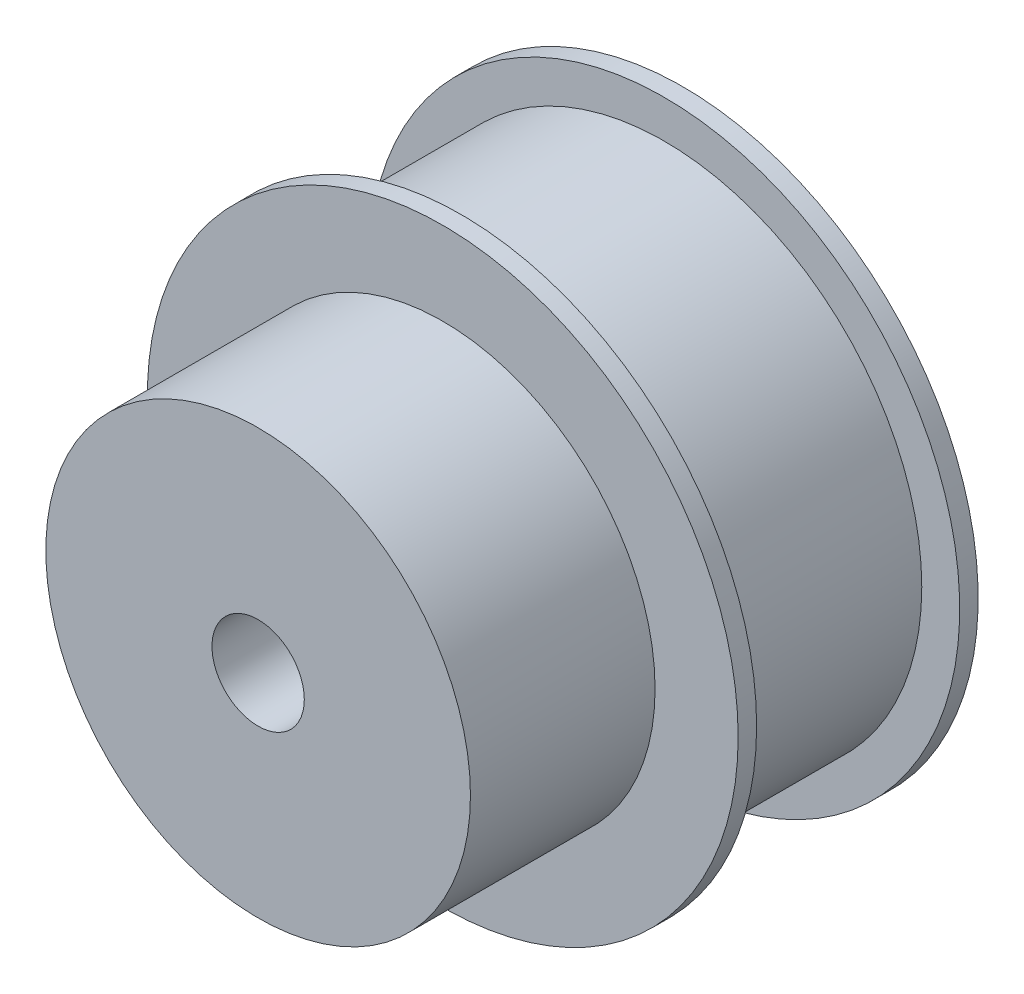
ISO-10303-21;
HEADER;
FILE_DESCRIPTION(('STEP AP214'),'2;1');
FILE_NAME('part.step','',(''),(''),'','','');
FILE_SCHEMA(('AUTOMOTIVE_DESIGN { 1 0 10303 214 1 1 1 1 }'));
ENDSEC;
DATA;
#1=APPLICATION_CONTEXT('core data for automotive mechanical design processes');
#2=APPLICATION_PROTOCOL_DEFINITION('international standard','automotive_design',2000,#1);
#3=PRODUCT_CONTEXT('',#1,'mechanical');
#4=PRODUCT('Part','Part','',(#3));
#5=PRODUCT_RELATED_PRODUCT_CATEGORY('part','',(#4));
#6=PRODUCT_DEFINITION_FORMATION('','',#4);
#7=PRODUCT_DEFINITION_CONTEXT('part definition',#1,'design');
#8=PRODUCT_DEFINITION('design','',#6,#7);
#9=PRODUCT_DEFINITION_SHAPE('','',#8);
#10=(LENGTH_UNIT() NAMED_UNIT(*) SI_UNIT(.MILLI.,.METRE.));
#11=(NAMED_UNIT(*) PLANE_ANGLE_UNIT() SI_UNIT($,.RADIAN.));
#12=(NAMED_UNIT(*) SI_UNIT($,.STERADIAN.) SOLID_ANGLE_UNIT());
#13=UNCERTAINTY_MEASURE_WITH_UNIT(LENGTH_MEASURE(1.E-05),#10,'distance_accuracy_value','');
#14=(GEOMETRIC_REPRESENTATION_CONTEXT(3) GLOBAL_UNCERTAINTY_ASSIGNED_CONTEXT((#13)) GLOBAL_UNIT_ASSIGNED_CONTEXT((#10,
#11,#12)) REPRESENTATION_CONTEXT('',''));
#15=CARTESIAN_POINT('',(0.,0.,0.));
#16=DIRECTION('',(0.,0.,1.));
#17=DIRECTION('',(1.,0.,0.));
#18=AXIS2_PLACEMENT_3D('',#15,#16,#17);
#19=CARTESIAN_POINT('',(0.,0.,-23.));
#20=DIRECTION('',(0.,0.,1.));
#21=DIRECTION('',(1.,0.,0.));
#22=AXIS2_PLACEMENT_3D('',#19,#20,#21);
#23=CYLINDRICAL_SURFACE('',#22,13.945);
#24=CARTESIAN_POINT('',(0.,0.,-22.));
#25=DIRECTION('',(0.,0.,-1.));
#26=DIRECTION('',(-1.,0.,0.));
#27=AXIS2_PLACEMENT_3D('',#24,#25,#26);
#28=CIRCLE('',#27,13.945);
#29=CARTESIAN_POINT('',(13.945,0.,-22.));
#30=VERTEX_POINT('',#29);
#31=EDGE_CURVE('E43',#30,#30,#28,.T.);
#32=CARTESIAN_POINT('',(0.,0.,-11.));
#33=DIRECTION('',(0.,0.,1.));
#34=DIRECTION('',(1.,0.,0.));
#35=AXIS2_PLACEMENT_3D('',#32,#33,#34);
#36=CIRCLE('',#35,13.945);
#37=CARTESIAN_POINT('',(13.945,0.,-11.));
#38=VERTEX_POINT('',#37);
#39=EDGE_CURVE('E10',#38,#38,#36,.T.);
#40=CARTESIAN_POINT('',(13.945,0.,-22.));
#41=CARTESIAN_POINT('',(13.945,0.,-21.8854166666667));
#42=CARTESIAN_POINT('',(13.945,0.,-21.7708333333333));
#43=CARTESIAN_POINT('',(13.945,0.,-21.5416666666667));
#44=CARTESIAN_POINT('',(13.945,0.,-21.4270833333333));
#45=CARTESIAN_POINT('',(13.945,0.,-21.1979166666667));
#46=CARTESIAN_POINT('',(13.945,0.,-21.0833333333333));
#47=CARTESIAN_POINT('',(13.945,0.,-20.8541666666667));
#48=CARTESIAN_POINT('',(13.945,0.,-20.7395833333333));
#49=CARTESIAN_POINT('',(13.945,0.,-20.5104166666667));
#50=CARTESIAN_POINT('',(13.945,0.,-20.3958333333333));
#51=CARTESIAN_POINT('',(13.945,0.,-20.1666666666667));
#52=CARTESIAN_POINT('',(13.945,0.,-20.0520833333333));
#53=CARTESIAN_POINT('',(13.945,0.,-19.8229166666667));
#54=CARTESIAN_POINT('',(13.945,0.,-19.7083333333333));
#55=CARTESIAN_POINT('',(13.945,0.,-19.4791666666667));
#56=CARTESIAN_POINT('',(13.945,0.,-19.3645833333333));
#57=CARTESIAN_POINT('',(13.945,0.,-19.1354166666667));
#58=CARTESIAN_POINT('',(13.945,0.,-19.0208333333333));
#59=CARTESIAN_POINT('',(13.945,0.,-18.7916666666667));
#60=CARTESIAN_POINT('',(13.945,0.,-18.6770833333333));
#61=CARTESIAN_POINT('',(13.945,0.,-18.4479166666667));
#62=CARTESIAN_POINT('',(13.945,0.,-18.3333333333333));
#63=CARTESIAN_POINT('',(13.945,0.,-18.1041666666667));
#64=CARTESIAN_POINT('',(13.945,0.,-17.9895833333333));
#65=CARTESIAN_POINT('',(13.945,0.,-17.7604166666667));
#66=CARTESIAN_POINT('',(13.945,0.,-17.6458333333333));
#67=CARTESIAN_POINT('',(13.945,0.,-17.4166666666667));
#68=CARTESIAN_POINT('',(13.945,0.,-17.3020833333333));
#69=CARTESIAN_POINT('',(13.945,0.,-17.0729166666667));
#70=CARTESIAN_POINT('',(13.945,0.,-16.9583333333333));
#71=CARTESIAN_POINT('',(13.945,0.,-16.7291666666667));
#72=CARTESIAN_POINT('',(13.945,0.,-16.6145833333333));
#73=CARTESIAN_POINT('',(13.945,0.,-16.3854166666667));
#74=CARTESIAN_POINT('',(13.945,0.,-16.2708333333333));
#75=CARTESIAN_POINT('',(13.945,0.,-16.0416666666667));
#76=CARTESIAN_POINT('',(13.945,0.,-15.9270833333333));
#77=CARTESIAN_POINT('',(13.945,0.,-15.6979166666667));
#78=CARTESIAN_POINT('',(13.945,0.,-15.5833333333333));
#79=CARTESIAN_POINT('',(13.945,0.,-15.3541666666667));
#80=CARTESIAN_POINT('',(13.945,0.,-15.2395833333333));
#81=CARTESIAN_POINT('',(13.945,0.,-15.0104166666667));
#82=CARTESIAN_POINT('',(13.945,0.,-14.8958333333333));
#83=CARTESIAN_POINT('',(13.945,0.,-14.6666666666667));
#84=CARTESIAN_POINT('',(13.945,0.,-14.5520833333333));
#85=CARTESIAN_POINT('',(13.945,0.,-14.3229166666667));
#86=CARTESIAN_POINT('',(13.945,0.,-14.2083333333333));
#87=CARTESIAN_POINT('',(13.945,0.,-13.9791666666667));
#88=CARTESIAN_POINT('',(13.945,0.,-13.8645833333333));
#89=CARTESIAN_POINT('',(13.945,0.,-13.6354166666667));
#90=CARTESIAN_POINT('',(13.945,0.,-13.5208333333333));
#91=CARTESIAN_POINT('',(13.945,0.,-13.2916666666667));
#92=CARTESIAN_POINT('',(13.945,0.,-13.1770833333333));
#93=CARTESIAN_POINT('',(13.945,0.,-12.9479166666667));
#94=CARTESIAN_POINT('',(13.945,0.,-12.8333333333333));
#95=CARTESIAN_POINT('',(13.945,0.,-12.6041666666667));
#96=CARTESIAN_POINT('',(13.945,0.,-12.4895833333333));
#97=CARTESIAN_POINT('',(13.945,0.,-12.2604166666667));
#98=CARTESIAN_POINT('',(13.945,0.,-12.1458333333333));
#99=CARTESIAN_POINT('',(13.945,0.,-11.9166666666667));
#100=CARTESIAN_POINT('',(13.945,0.,-11.8020833333333));
#101=CARTESIAN_POINT('',(13.945,0.,-11.5729166666667));
#102=CARTESIAN_POINT('',(13.945,0.,-11.4583333333333));
#103=CARTESIAN_POINT('',(13.945,0.,-11.2291666666667));
#104=CARTESIAN_POINT('',(13.945,0.,-11.1145833333333));
#105=CARTESIAN_POINT('',(13.945,0.,-11.));
#106=B_SPLINE_CURVE_WITH_KNOTS('',3,(#40,#41,#42,#43,#44,#45,#46,#47,#48,#49,#50,#51,#52,#53,
#54,#55,#56,#57,#58,#59,#60,#61,#62,#63,#64,#65,#66,#67,#68,#69,#70,#71,#72,#73,#74,#75,#76,#77,
#78,#79,#80,#81,#82,#83,#84,#85,#86,#87,#88,#89,#90,#91,#92,#93,#94,#95,#96,#97,#98,#99,#100,
#101,#102,#103,#104,#105),.UNSPECIFIED.,.F.,.F.,(4,2,2,2,2,2,2,2,2,2,2,2,2,2,2,2,2,2,2,2,2,2,2,
2,2,2,2,2,2,2,2,2,4),(0.,0.343749999999997,0.687499999999997,1.03125,1.375,1.71875,2.0625,
2.40625,2.75,3.09375,3.4375,3.78125,4.125,4.46875,4.8125,5.15625,5.5,5.84375,6.18749999999999,
6.53125,6.875,7.21875,7.56249999999999,7.90624999999999,8.24999999999999,8.59374999999999,
8.93749999999999,9.28124999999999,9.62499999999999,9.96874999999999,10.3125,10.65625,11.),.UNSPECIFIED.);
#107=EDGE_CURVE('BSEAM36',#30,#38,#106,.T.);
#108=ORIENTED_EDGE('',*,*,#31,.F.);
#109=ORIENTED_EDGE('',*,*,#39,.F.);
#110=ORIENTED_EDGE('',*,*,#107,.T.);
#111=ORIENTED_EDGE('',*,*,#107,.F.);
#112=EDGE_LOOP('',(#108,#110,#109,#111));
#113=FACE_BOUND('',#112,.T.);
#114=ADVANCED_FACE('F36',(#113),#23,.T.);
#115=CARTESIAN_POINT('',(0.,0.,-22.));
#116=DIRECTION('',(0.,0.,-1.));
#117=DIRECTION('',(-1.,0.,0.));
#118=AXIS2_PLACEMENT_3D('',#115,#116,#117);
#119=CYLINDRICAL_SURFACE('',#118,16.);
#120=CARTESIAN_POINT('',(0.,0.,-22.));
#121=DIRECTION('',(0.,0.,-1.));
#122=DIRECTION('',(-1.,0.,0.));
#123=AXIS2_PLACEMENT_3D('',#120,#121,#122);
#124=CIRCLE('',#123,16.);
#125=CARTESIAN_POINT('',(-16.,0.,-22.));
#126=VERTEX_POINT('',#125);
#127=EDGE_CURVE('E56',#126,#126,#124,.T.);
#128=ORIENTED_EDGE('',*,*,#127,.T.);
#129=EDGE_LOOP('',(#128));
#130=FACE_BOUND('',#129,.T.);
#131=CARTESIAN_POINT('',(0.,0.,-23.));
#132=DIRECTION('',(0.,0.,-1.));
#133=DIRECTION('',(-1.,0.,0.));
#134=AXIS2_PLACEMENT_3D('',#131,#132,#133);
#135=CIRCLE('',#134,16.);
#136=CARTESIAN_POINT('',(-16.,0.,-23.));
#137=VERTEX_POINT('',#136);
#138=EDGE_CURVE('E57',#137,#137,#135,.T.);
#139=ORIENTED_EDGE('',*,*,#138,.F.);
#140=EDGE_LOOP('',(#139));
#141=FACE_BOUND('',#140,.T.);
#142=ADVANCED_FACE('F99',(#130,#141),#119,.T.);
#143=CARTESIAN_POINT('',(0.,0.,-22.));
#144=DIRECTION('',(0.,0.,-1.));
#145=DIRECTION('',(-1.,0.,0.));
#146=AXIS2_PLACEMENT_3D('',#143,#144,#145);
#147=PLANE('',#146);
#148=ORIENTED_EDGE('',*,*,#31,.T.);
#149=EDGE_LOOP('',(#148));
#150=FACE_BOUND('',#149,.T.);
#151=ORIENTED_EDGE('',*,*,#127,.F.);
#152=EDGE_LOOP('',(#151));
#153=FACE_BOUND('',#152,.T.);
#154=ADVANCED_FACE('F105',(#150,#153),#147,.F.);
#155=CARTESIAN_POINT('',(0.,0.,-23.));
#156=DIRECTION('',(0.,0.,-1.));
#157=DIRECTION('',(-1.,0.,0.));
#158=AXIS2_PLACEMENT_3D('',#155,#156,#157);
#159=PLANE('',#158);
#160=CARTESIAN_POINT('',(0.,0.,-23.));
#161=DIRECTION('',(0.,0.,1.));
#162=DIRECTION('',(1.,0.,0.));
#163=AXIS2_PLACEMENT_3D('',#160,#161,#162);
#164=CIRCLE('',#163,2.5);
#165=CARTESIAN_POINT('',(2.5,0.,-23.));
#166=VERTEX_POINT('',#165);
#167=EDGE_CURVE('E66',#166,#166,#164,.T.);
#168=ORIENTED_EDGE('',*,*,#167,.T.);
#169=EDGE_LOOP('',(#168));
#170=FACE_BOUND('',#169,.T.);
#171=ORIENTED_EDGE('',*,*,#138,.T.);
#172=EDGE_LOOP('',(#171));
#173=FACE_BOUND('',#172,.T.);
#174=ADVANCED_FACE('F75',(#170,#173),#159,.T.);
#175=CARTESIAN_POINT('',(0.,0.,-11.));
#176=DIRECTION('',(0.,0.,1.));
#177=DIRECTION('',(1.,0.,0.));
#178=AXIS2_PLACEMENT_3D('',#175,#176,#177);
#179=CYLINDRICAL_SURFACE('',#178,16.);
#180=CARTESIAN_POINT('',(0.,0.,-11.));
#181=DIRECTION('',(0.,0.,1.));
#182=DIRECTION('',(1.,0.,0.));
#183=AXIS2_PLACEMENT_3D('',#180,#181,#182);
#184=CIRCLE('',#183,16.);
#185=CARTESIAN_POINT('',(16.,0.,-11.));
#186=VERTEX_POINT('',#185);
#187=EDGE_CURVE('E60',#186,#186,#184,.T.);
#188=ORIENTED_EDGE('',*,*,#187,.T.);
#189=EDGE_LOOP('',(#188));
#190=FACE_BOUND('',#189,.T.);
#191=CARTESIAN_POINT('',(0.,0.,-10.));
#192=DIRECTION('',(0.,0.,1.));
#193=DIRECTION('',(1.,0.,0.));
#194=AXIS2_PLACEMENT_3D('',#191,#192,#193);
#195=CIRCLE('',#194,16.);
#196=CARTESIAN_POINT('',(16.,0.,-10.));
#197=VERTEX_POINT('',#196);
#198=EDGE_CURVE('E63',#197,#197,#195,.T.);
#199=ORIENTED_EDGE('',*,*,#198,.F.);
#200=EDGE_LOOP('',(#199));
#201=FACE_BOUND('',#200,.T.);
#202=ADVANCED_FACE('F111',(#190,#201),#179,.T.);
#203=CARTESIAN_POINT('',(0.,0.,-11.));
#204=DIRECTION('',(0.,0.,1.));
#205=DIRECTION('',(1.,0.,0.));
#206=AXIS2_PLACEMENT_3D('',#203,#204,#205);
#207=PLANE('',#206);
#208=ORIENTED_EDGE('',*,*,#39,.T.);
#209=EDGE_LOOP('',(#208));
#210=FACE_BOUND('',#209,.T.);
#211=ORIENTED_EDGE('',*,*,#187,.F.);
#212=EDGE_LOOP('',(#211));
#213=FACE_BOUND('',#212,.T.);
#214=ADVANCED_FACE('F88',(#210,#213),#207,.F.);
#215=CARTESIAN_POINT('',(0.,0.,0.));
#216=DIRECTION('',(0.,0.,1.));
#217=DIRECTION('',(1.,0.,0.));
#218=AXIS2_PLACEMENT_3D('',#215,#216,#217);
#219=PLANE('',#218);
#220=CARTESIAN_POINT('',(0.,0.,0.));
#221=DIRECTION('',(0.,0.,1.));
#222=DIRECTION('',(1.,0.,0.));
#223=AXIS2_PLACEMENT_3D('',#220,#221,#222);
#224=CIRCLE('',#223,2.5);
#225=CARTESIAN_POINT('',(2.5,0.,0.));
#226=VERTEX_POINT('',#225);
#227=EDGE_CURVE('E69',#226,#226,#224,.T.);
#228=ORIENTED_EDGE('',*,*,#227,.F.);
#229=EDGE_LOOP('',(#228));
#230=FACE_BOUND('',#229,.T.);
#231=CARTESIAN_POINT('',(0.,0.,0.));
#232=DIRECTION('',(0.,0.,1.));
#233=DIRECTION('',(1.,0.,0.));
#234=AXIS2_PLACEMENT_3D('',#231,#232,#233);
#235=CIRCLE('',#234,11.5);
#236=CARTESIAN_POINT('',(11.5,0.,0.));
#237=VERTEX_POINT('',#236);
#238=EDGE_CURVE('E47',#237,#237,#235,.T.);
#239=ORIENTED_EDGE('',*,*,#238,.T.);
#240=EDGE_LOOP('',(#239));
#241=FACE_BOUND('',#240,.T.);
#242=ADVANCED_FACE('F85',(#230,#241),#219,.T.);
#243=CARTESIAN_POINT('',(0.,0.,-10.));
#244=DIRECTION('',(0.,0.,1.));
#245=DIRECTION('',(1.,0.,0.));
#246=AXIS2_PLACEMENT_3D('',#243,#244,#245);
#247=CYLINDRICAL_SURFACE('',#246,11.5);
#248=CARTESIAN_POINT('',(0.,0.,-10.));
#249=DIRECTION('',(0.,0.,1.));
#250=DIRECTION('',(1.,0.,0.));
#251=AXIS2_PLACEMENT_3D('',#248,#249,#250);
#252=CIRCLE('',#251,11.5);
#253=CARTESIAN_POINT('',(11.5,0.,-10.));
#254=VERTEX_POINT('',#253);
#255=EDGE_CURVE('E51',#254,#254,#252,.T.);
#256=ORIENTED_EDGE('',*,*,#255,.T.);
#257=EDGE_LOOP('',(#256));
#258=FACE_BOUND('',#257,.T.);
#259=ORIENTED_EDGE('',*,*,#238,.F.);
#260=EDGE_LOOP('',(#259));
#261=FACE_BOUND('',#260,.T.);
#262=ADVANCED_FACE('F38',(#258,#261),#247,.T.);
#263=CARTESIAN_POINT('',(0.,0.,-10.));
#264=DIRECTION('',(0.,0.,-1.));
#265=DIRECTION('',(-1.,0.,0.));
#266=AXIS2_PLACEMENT_3D('',#263,#264,#265);
#267=PLANE('',#266);
#268=ORIENTED_EDGE('',*,*,#255,.F.);
#269=EDGE_LOOP('',(#268));
#270=FACE_BOUND('',#269,.T.);
#271=ORIENTED_EDGE('',*,*,#198,.T.);
#272=EDGE_LOOP('',(#271));
#273=FACE_BOUND('',#272,.T.);
#274=ADVANCED_FACE('F81',(#270,#273),#267,.F.);
#275=CARTESIAN_POINT('',(0.,0.,-23.));
#276=DIRECTION('',(0.,0.,1.));
#277=DIRECTION('',(1.,0.,0.));
#278=AXIS2_PLACEMENT_3D('',#275,#276,#277);
#279=CYLINDRICAL_SURFACE('',#278,2.5);
#280=ORIENTED_EDGE('',*,*,#167,.F.);
#281=EDGE_LOOP('',(#280));
#282=FACE_BOUND('',#281,.T.);
#283=ORIENTED_EDGE('',*,*,#227,.T.);
#284=EDGE_LOOP('',(#283));
#285=FACE_BOUND('',#284,.T.);
#286=ADVANCED_FACE('F78',(#282,#285),#279,.F.);
#287=CLOSED_SHELL('',(#114,#142,#154,#174,#202,#214,#242,#262,#274,#286));
#288=MANIFOLD_SOLID_BREP('B2',#287);
#289=ADVANCED_BREP_SHAPE_REPRESENTATION('',(#18,#288),#14);
#290=SHAPE_DEFINITION_REPRESENTATION(#9,#289);
ENDSEC;
END-ISO-10303-21;
